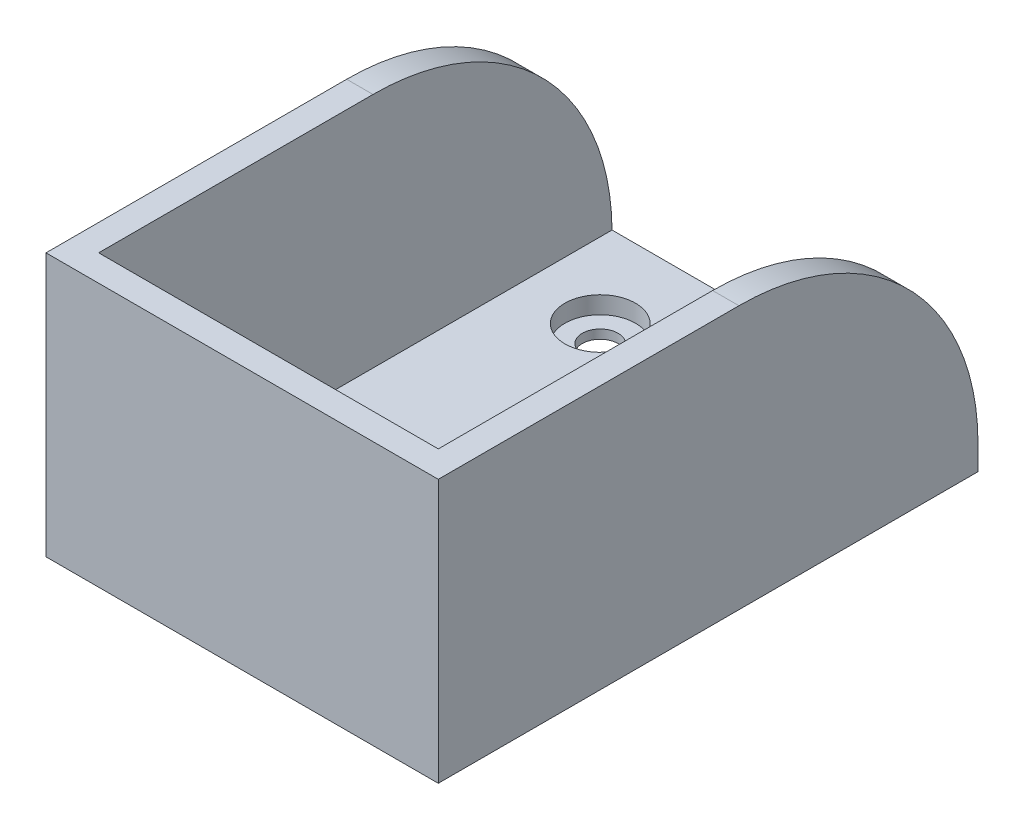
ISO-10303-21;
HEADER;
FILE_DESCRIPTION(('STEP AP214'),'2;1');
FILE_NAME('part.step','',(''),(''),'','','');
FILE_SCHEMA(('AUTOMOTIVE_DESIGN { 1 0 10303 214 1 1 1 1 }'));
ENDSEC;
DATA;
#1=APPLICATION_CONTEXT('core data for automotive mechanical design processes');
#2=APPLICATION_PROTOCOL_DEFINITION('international standard','automotive_design',2000,#1);
#3=PRODUCT_CONTEXT('',#1,'mechanical');
#4=PRODUCT('Part','Part','',(#3));
#5=PRODUCT_RELATED_PRODUCT_CATEGORY('part','',(#4));
#6=PRODUCT_DEFINITION_FORMATION('','',#4);
#7=PRODUCT_DEFINITION_CONTEXT('part definition',#1,'design');
#8=PRODUCT_DEFINITION('design','',#6,#7);
#9=PRODUCT_DEFINITION_SHAPE('','',#8);
#10=(LENGTH_UNIT() NAMED_UNIT(*) SI_UNIT(.MILLI.,.METRE.));
#11=(NAMED_UNIT(*) PLANE_ANGLE_UNIT() SI_UNIT($,.RADIAN.));
#12=(NAMED_UNIT(*) SI_UNIT($,.STERADIAN.) SOLID_ANGLE_UNIT());
#13=UNCERTAINTY_MEASURE_WITH_UNIT(LENGTH_MEASURE(1.E-05),#10,'distance_accuracy_value','');
#14=(GEOMETRIC_REPRESENTATION_CONTEXT(3) GLOBAL_UNCERTAINTY_ASSIGNED_CONTEXT((#13)) GLOBAL_UNIT_ASSIGNED_CONTEXT((#10,
#11,#12)) REPRESENTATION_CONTEXT('',''));
#15=CARTESIAN_POINT('',(0.,0.,0.));
#16=DIRECTION('',(0.,0.,1.));
#17=DIRECTION('',(1.,0.,0.));
#18=AXIS2_PLACEMENT_3D('',#15,#16,#17);
#19=CARTESIAN_POINT('',(-16.125,2.5,-23.125));
#20=DIRECTION('',(0.,0.,1.));
#21=DIRECTION('',(1.,0.,0.));
#22=AXIS2_PLACEMENT_3D('',#19,#20,#21);
#23=PLANE('',#22);
#24=DIRECTION('',(1.,0.,0.));
#25=VECTOR('',#24,1.);
#26=CARTESIAN_POINT('',(-16.125,2.3,-23.125));
#27=LINE('',#26,#25);
#28=CARTESIAN_POINT('',(-18.625,2.3,-23.125));
#29=VERTEX_POINT('',#28);
#30=CARTESIAN_POINT('',(18.625,2.3,-23.125));
#31=VERTEX_POINT('',#30);
#32=EDGE_CURVE('E274',#29,#31,#27,.T.);
#33=ORIENTED_EDGE('',*,*,#32,.T.);
#34=DIRECTION('',(0.,1.,0.));
#35=VECTOR('',#34,1.);
#36=CARTESIAN_POINT('',(18.625,0.,-23.125));
#37=LINE('',#36,#35);
#38=CARTESIAN_POINT('',(18.625,0.,-23.125));
#39=VERTEX_POINT('',#38);
#40=EDGE_CURVE('E167',#39,#31,#37,.T.);
#41=ORIENTED_EDGE('',*,*,#40,.F.);
#42=DIRECTION('',(-1.,0.,0.));
#43=VECTOR('',#42,1.);
#44=CARTESIAN_POINT('',(-16.125,0.,-23.125));
#45=LINE('',#44,#43);
#46=CARTESIAN_POINT('',(-18.625,0.,-23.125));
#47=VERTEX_POINT('',#46);
#48=EDGE_CURVE('E253',#39,#47,#45,.T.);
#49=ORIENTED_EDGE('',*,*,#48,.T.);
#50=DIRECTION('',(0.,1.,0.));
#51=VECTOR('',#50,1.);
#52=CARTESIAN_POINT('',(-18.625,0.,-23.125));
#53=LINE('',#52,#51);
#54=EDGE_CURVE('E117',#47,#29,#53,.T.);
#55=ORIENTED_EDGE('',*,*,#54,.T.);
#56=EDGE_LOOP('',(#33,#41,#49,#55));
#57=FACE_BOUND('',#56,.T.);
#58=ADVANCED_FACE('F39',(#57),#23,.F.);
#59=CARTESIAN_POINT('',(0.,2.5,0.));
#60=DIRECTION('',(0.,-1.,0.));
#61=DIRECTION('',(0.,0.,-1.));
#62=AXIS2_PLACEMENT_3D('',#59,#60,#61);
#63=PLANE('',#62);
#64=CARTESIAN_POINT('',(0.,2.5,9.125));
#65=DIRECTION('',(0.,1.,0.));
#66=DIRECTION('',(0.,0.,1.));
#67=AXIS2_PLACEMENT_3D('',#64,#65,#66);
#68=CIRCLE('',#67,3.125);
#69=CARTESIAN_POINT('',(0.,2.5,12.25));
#70=VERTEX_POINT('',#69);
#71=EDGE_CURVE('E179',#70,#70,#68,.T.);
#72=ORIENTED_EDGE('',*,*,#71,.F.);
#73=EDGE_LOOP('',(#72));
#74=FACE_BOUND('',#73,.T.);
#75=CARTESIAN_POINT('',(-8.99999999999999,2.5,-14.875));
#76=DIRECTION('',(0.,1.,0.));
#77=DIRECTION('',(0.,0.,1.));
#78=AXIS2_PLACEMENT_3D('',#75,#76,#77);
#79=CIRCLE('',#78,3.35);
#80=CARTESIAN_POINT('',(-8.99999999999999,2.5,-11.525));
#81=VERTEX_POINT('',#80);
#82=EDGE_CURVE('E189',#81,#81,#79,.T.);
#83=ORIENTED_EDGE('',*,*,#82,.F.);
#84=EDGE_LOOP('',(#83));
#85=FACE_BOUND('',#84,.T.);
#86=CARTESIAN_POINT('',(9.00000000000001,2.5,-14.875));
#87=DIRECTION('',(0.,1.,0.));
#88=DIRECTION('',(0.,0.,1.));
#89=AXIS2_PLACEMENT_3D('',#86,#87,#88);
#90=CIRCLE('',#89,3.35);
#91=CARTESIAN_POINT('',(9.00000000000001,2.5,-11.525));
#92=VERTEX_POINT('',#91);
#93=EDGE_CURVE('E205',#92,#92,#90,.T.);
#94=ORIENTED_EDGE('',*,*,#93,.F.);
#95=EDGE_LOOP('',(#94));
#96=FACE_BOUND('',#95,.T.);
#97=CARTESIAN_POINT('',(9.00000000000001,2.5,18.125));
#98=DIRECTION('',(0.,1.,0.));
#99=DIRECTION('',(0.,0.,1.));
#100=AXIS2_PLACEMENT_3D('',#97,#98,#99);
#101=CIRCLE('',#100,3.35);
#102=CARTESIAN_POINT('',(9.00000000000001,2.5,21.475));
#103=VERTEX_POINT('',#102);
#104=EDGE_CURVE('E221',#103,#103,#101,.T.);
#105=ORIENTED_EDGE('',*,*,#104,.F.);
#106=EDGE_LOOP('',(#105));
#107=FACE_BOUND('',#106,.T.);
#108=CARTESIAN_POINT('',(-8.99999999999999,2.5,18.125));
#109=DIRECTION('',(0.,1.,0.));
#110=DIRECTION('',(0.,0.,1.));
#111=AXIS2_PLACEMENT_3D('',#108,#109,#110);
#112=CIRCLE('',#111,3.35);
#113=CARTESIAN_POINT('',(-8.99999999999999,2.5,21.475));
#114=VERTEX_POINT('',#113);
#115=EDGE_CURVE('E237',#114,#114,#112,.T.);
#116=ORIENTED_EDGE('',*,*,#115,.F.);
#117=EDGE_LOOP('',(#116));
#118=FACE_BOUND('',#117,.T.);
#119=DIRECTION('',(0.,0.,-1.));
#120=VECTOR('',#119,1.);
#121=CARTESIAN_POINT('',(16.125,2.5,23.125));
#122=LINE('',#121,#120);
#123=CARTESIAN_POINT('',(16.125,2.5,25.625));
#124=VERTEX_POINT('',#123);
#125=CARTESIAN_POINT('',(16.125,2.5,-23.1241189256323));
#126=VERTEX_POINT('',#125);
#127=EDGE_CURVE('E254',#124,#126,#122,.T.);
#128=ORIENTED_EDGE('',*,*,#127,.T.);
#129=DIRECTION('',(1.,0.,0.));
#130=VECTOR('',#129,1.);
#131=CARTESIAN_POINT('',(16.125,2.5,-23.1241189256323));
#132=LINE('',#131,#130);
#133=CARTESIAN_POINT('',(-16.125,2.5,-23.1241189256323));
#134=VERTEX_POINT('',#133);
#135=EDGE_CURVE('E271',#126,#134,#132,.F.);
#136=ORIENTED_EDGE('',*,*,#135,.T.);
#137=DIRECTION('',(0.,0.,1.));
#138=VECTOR('',#137,1.);
#139=CARTESIAN_POINT('',(-16.125,2.5,23.125));
#140=LINE('',#139,#138);
#141=CARTESIAN_POINT('',(-16.125,2.5,25.625));
#142=VERTEX_POINT('',#141);
#143=EDGE_CURVE('E258',#134,#142,#140,.T.);
#144=ORIENTED_EDGE('',*,*,#143,.T.);
#145=DIRECTION('',(-1.,0.,0.));
#146=VECTOR('',#145,1.);
#147=CARTESIAN_POINT('',(16.125,2.5,25.625));
#148=LINE('',#147,#146);
#149=EDGE_CURVE('E152',#124,#142,#148,.T.);
#150=ORIENTED_EDGE('',*,*,#149,.F.);
#151=EDGE_LOOP('',(#128,#136,#144,#150));
#152=FACE_BOUND('',#151,.T.);
#153=ADVANCED_FACE('F295',(#74,#85,#96,#107,#118,#152),#63,.F.);
#154=CARTESIAN_POINT('',(0.,0.,0.));
#155=DIRECTION('',(0.,-1.,0.));
#156=DIRECTION('',(0.,0.,-1.));
#157=AXIS2_PLACEMENT_3D('',#154,#155,#156);
#158=PLANE('',#157);
#159=CARTESIAN_POINT('',(0.,0.,9.125));
#160=DIRECTION('',(0.,1.,0.));
#161=DIRECTION('',(0.,0.,1.));
#162=AXIS2_PLACEMENT_3D('',#159,#160,#161);
#163=CIRCLE('',#162,3.125);
#164=CARTESIAN_POINT('',(0.,0.,12.25));
#165=VERTEX_POINT('',#164);
#166=EDGE_CURVE('E185',#165,#165,#163,.T.);
#167=ORIENTED_EDGE('',*,*,#166,.T.);
#168=EDGE_LOOP('',(#167));
#169=FACE_BOUND('',#168,.T.);
#170=CARTESIAN_POINT('',(-8.99999999999999,0.,-14.875));
#171=DIRECTION('',(0.,1.,0.));
#172=DIRECTION('',(0.,0.,1.));
#173=AXIS2_PLACEMENT_3D('',#170,#171,#172);
#174=CIRCLE('',#173,1.7);
#175=CARTESIAN_POINT('',(-8.99999999999999,0.,-13.175));
#176=VERTEX_POINT('',#175);
#177=EDGE_CURVE('E201',#176,#176,#174,.T.);
#178=ORIENTED_EDGE('',*,*,#177,.T.);
#179=EDGE_LOOP('',(#178));
#180=FACE_BOUND('',#179,.T.);
#181=CARTESIAN_POINT('',(9.00000000000001,0.,-14.875));
#182=DIRECTION('',(0.,1.,0.));
#183=DIRECTION('',(0.,0.,1.));
#184=AXIS2_PLACEMENT_3D('',#181,#182,#183);
#185=CIRCLE('',#184,1.7);
#186=CARTESIAN_POINT('',(9.00000000000001,0.,-13.175));
#187=VERTEX_POINT('',#186);
#188=EDGE_CURVE('E217',#187,#187,#185,.T.);
#189=ORIENTED_EDGE('',*,*,#188,.T.);
#190=EDGE_LOOP('',(#189));
#191=FACE_BOUND('',#190,.T.);
#192=CARTESIAN_POINT('',(9.00000000000001,0.,18.125));
#193=DIRECTION('',(0.,1.,0.));
#194=DIRECTION('',(0.,0.,1.));
#195=AXIS2_PLACEMENT_3D('',#192,#193,#194);
#196=CIRCLE('',#195,1.7);
#197=CARTESIAN_POINT('',(9.00000000000001,0.,19.825));
#198=VERTEX_POINT('',#197);
#199=EDGE_CURVE('E233',#198,#198,#196,.T.);
#200=ORIENTED_EDGE('',*,*,#199,.T.);
#201=EDGE_LOOP('',(#200));
#202=FACE_BOUND('',#201,.T.);
#203=CARTESIAN_POINT('',(-8.99999999999999,0.,18.125));
#204=DIRECTION('',(0.,1.,0.));
#205=DIRECTION('',(0.,0.,1.));
#206=AXIS2_PLACEMENT_3D('',#203,#204,#205);
#207=CIRCLE('',#206,1.7);
#208=CARTESIAN_POINT('',(-8.99999999999999,0.,19.825));
#209=VERTEX_POINT('',#208);
#210=EDGE_CURVE('E249',#209,#209,#207,.T.);
#211=ORIENTED_EDGE('',*,*,#210,.T.);
#212=EDGE_LOOP('',(#211));
#213=FACE_BOUND('',#212,.T.);
#214=ORIENTED_EDGE('',*,*,#48,.F.);
#215=DIRECTION('',(0.,0.,-1.));
#216=VECTOR('',#215,1.);
#217=CARTESIAN_POINT('',(18.625,0.,23.125));
#218=LINE('',#217,#216);
#219=CARTESIAN_POINT('',(18.625,0.,28.125));
#220=VERTEX_POINT('',#219);
#221=EDGE_CURVE('E126',#220,#39,#218,.T.);
#222=ORIENTED_EDGE('',*,*,#221,.F.);
#223=DIRECTION('',(1.,0.,0.));
#224=VECTOR('',#223,1.);
#225=CARTESIAN_POINT('',(-18.625,0.,28.125));
#226=LINE('',#225,#224);
#227=CARTESIAN_POINT('',(-18.625,0.,28.125));
#228=VERTEX_POINT('',#227);
#229=EDGE_CURVE('E123',#228,#220,#226,.T.);
#230=ORIENTED_EDGE('',*,*,#229,.F.);
#231=DIRECTION('',(0.,0.,-1.));
#232=VECTOR('',#231,1.);
#233=CARTESIAN_POINT('',(-18.625,0.,23.125));
#234=LINE('',#233,#232);
#235=EDGE_CURVE('E111',#228,#47,#234,.T.);
#236=ORIENTED_EDGE('',*,*,#235,.T.);
#237=EDGE_LOOP('',(#214,#222,#230,#236));
#238=FACE_BOUND('',#237,.T.);
#239=ADVANCED_FACE('F124',(#169,#180,#191,#202,#213,#238),#158,.T.);
#240=CARTESIAN_POINT('',(-8.99999999999999,2.5,18.125));
#241=DIRECTION('',(0.,1.,0.));
#242=DIRECTION('',(0.,0.,1.));
#243=AXIS2_PLACEMENT_3D('',#240,#241,#242);
#244=CYLINDRICAL_SURFACE('',#243,1.7);
#245=ORIENTED_EDGE('',*,*,#210,.F.);
#246=EDGE_LOOP('',(#245));
#247=FACE_BOUND('',#246,.T.);
#248=CARTESIAN_POINT('',(-8.99999999999999,0.85,18.125));
#249=DIRECTION('',(0.,1.,0.));
#250=DIRECTION('',(0.,0.,1.));
#251=AXIS2_PLACEMENT_3D('',#248,#249,#250);
#252=CIRCLE('',#251,1.7);
#253=CARTESIAN_POINT('',(-8.99999999999999,0.85,19.825));
#254=VERTEX_POINT('',#253);
#255=EDGE_CURVE('E245',#254,#254,#252,.T.);
#256=ORIENTED_EDGE('',*,*,#255,.T.);
#257=EDGE_LOOP('',(#256));
#258=FACE_BOUND('',#257,.T.);
#259=ADVANCED_FACE('F312',(#247,#258),#244,.F.);
#260=CARTESIAN_POINT('',(-7.29999999999999,0.85,18.125));
#261=DIRECTION('',(0.,-1.,0.));
#262=DIRECTION('',(0.,0.,-1.));
#263=AXIS2_PLACEMENT_3D('',#260,#261,#262);
#264=PLANE('',#263);
#265=ORIENTED_EDGE('',*,*,#255,.F.);
#266=EDGE_LOOP('',(#265));
#267=FACE_BOUND('',#266,.T.);
#268=CARTESIAN_POINT('',(-8.99999999999999,0.85,18.125));
#269=DIRECTION('',(0.,1.,0.));
#270=DIRECTION('',(0.,0.,1.));
#271=AXIS2_PLACEMENT_3D('',#268,#269,#270);
#272=CIRCLE('',#271,3.35);
#273=CARTESIAN_POINT('',(-8.99999999999999,0.85,21.475));
#274=VERTEX_POINT('',#273);
#275=EDGE_CURVE('E241',#274,#274,#272,.T.);
#276=ORIENTED_EDGE('',*,*,#275,.T.);
#277=EDGE_LOOP('',(#276));
#278=FACE_BOUND('',#277,.T.);
#279=ADVANCED_FACE('F317',(#267,#278),#264,.F.);
#280=CARTESIAN_POINT('',(-8.99999999999999,2.5,18.125));
#281=DIRECTION('',(0.,1.,0.));
#282=DIRECTION('',(0.,0.,1.));
#283=AXIS2_PLACEMENT_3D('',#280,#281,#282);
#284=CYLINDRICAL_SURFACE('',#283,3.35);
#285=ORIENTED_EDGE('',*,*,#275,.F.);
#286=EDGE_LOOP('',(#285));
#287=FACE_BOUND('',#286,.T.);
#288=ORIENTED_EDGE('',*,*,#115,.T.);
#289=EDGE_LOOP('',(#288));
#290=FACE_BOUND('',#289,.T.);
#291=ADVANCED_FACE('F321',(#287,#290),#284,.F.);
#292=CARTESIAN_POINT('',(9.00000000000001,2.5,18.125));
#293=DIRECTION('',(0.,1.,0.));
#294=DIRECTION('',(0.,0.,1.));
#295=AXIS2_PLACEMENT_3D('',#292,#293,#294);
#296=CYLINDRICAL_SURFACE('',#295,1.7);
#297=ORIENTED_EDGE('',*,*,#199,.F.);
#298=EDGE_LOOP('',(#297));
#299=FACE_BOUND('',#298,.T.);
#300=CARTESIAN_POINT('',(9.00000000000001,0.85,18.125));
#301=DIRECTION('',(0.,1.,0.));
#302=DIRECTION('',(0.,0.,1.));
#303=AXIS2_PLACEMENT_3D('',#300,#301,#302);
#304=CIRCLE('',#303,1.7);
#305=CARTESIAN_POINT('',(9.00000000000001,0.85,19.825));
#306=VERTEX_POINT('',#305);
#307=EDGE_CURVE('E229',#306,#306,#304,.T.);
#308=ORIENTED_EDGE('',*,*,#307,.T.);
#309=EDGE_LOOP('',(#308));
#310=FACE_BOUND('',#309,.T.);
#311=ADVANCED_FACE('F325',(#299,#310),#296,.F.);
#312=CARTESIAN_POINT('',(10.7,0.85,18.125));
#313=DIRECTION('',(0.,-1.,0.));
#314=DIRECTION('',(0.,0.,-1.));
#315=AXIS2_PLACEMENT_3D('',#312,#313,#314);
#316=PLANE('',#315);
#317=ORIENTED_EDGE('',*,*,#307,.F.);
#318=EDGE_LOOP('',(#317));
#319=FACE_BOUND('',#318,.T.);
#320=CARTESIAN_POINT('',(9.00000000000001,0.85,18.125));
#321=DIRECTION('',(0.,1.,0.));
#322=DIRECTION('',(0.,0.,1.));
#323=AXIS2_PLACEMENT_3D('',#320,#321,#322);
#324=CIRCLE('',#323,3.35);
#325=CARTESIAN_POINT('',(9.00000000000001,0.85,21.475));
#326=VERTEX_POINT('',#325);
#327=EDGE_CURVE('E225',#326,#326,#324,.T.);
#328=ORIENTED_EDGE('',*,*,#327,.T.);
#329=EDGE_LOOP('',(#328));
#330=FACE_BOUND('',#329,.T.);
#331=ADVANCED_FACE('F329',(#319,#330),#316,.F.);
#332=CARTESIAN_POINT('',(9.00000000000001,2.5,18.125));
#333=DIRECTION('',(0.,1.,0.));
#334=DIRECTION('',(0.,0.,1.));
#335=AXIS2_PLACEMENT_3D('',#332,#333,#334);
#336=CYLINDRICAL_SURFACE('',#335,3.35);
#337=ORIENTED_EDGE('',*,*,#327,.F.);
#338=EDGE_LOOP('',(#337));
#339=FACE_BOUND('',#338,.T.);
#340=ORIENTED_EDGE('',*,*,#104,.T.);
#341=EDGE_LOOP('',(#340));
#342=FACE_BOUND('',#341,.T.);
#343=ADVANCED_FACE('F333',(#339,#342),#336,.F.);
#344=CARTESIAN_POINT('',(9.00000000000001,2.5,-14.875));
#345=DIRECTION('',(0.,1.,0.));
#346=DIRECTION('',(0.,0.,1.));
#347=AXIS2_PLACEMENT_3D('',#344,#345,#346);
#348=CYLINDRICAL_SURFACE('',#347,1.7);
#349=ORIENTED_EDGE('',*,*,#188,.F.);
#350=EDGE_LOOP('',(#349));
#351=FACE_BOUND('',#350,.T.);
#352=CARTESIAN_POINT('',(9.00000000000001,0.85,-14.875));
#353=DIRECTION('',(0.,1.,0.));
#354=DIRECTION('',(0.,0.,1.));
#355=AXIS2_PLACEMENT_3D('',#352,#353,#354);
#356=CIRCLE('',#355,1.7);
#357=CARTESIAN_POINT('',(9.00000000000001,0.85,-13.175));
#358=VERTEX_POINT('',#357);
#359=EDGE_CURVE('E213',#358,#358,#356,.T.);
#360=ORIENTED_EDGE('',*,*,#359,.T.);
#361=EDGE_LOOP('',(#360));
#362=FACE_BOUND('',#361,.T.);
#363=ADVANCED_FACE('F337',(#351,#362),#348,.F.);
#364=CARTESIAN_POINT('',(10.7,0.85,-14.875));
#365=DIRECTION('',(0.,-1.,0.));
#366=DIRECTION('',(0.,0.,-1.));
#367=AXIS2_PLACEMENT_3D('',#364,#365,#366);
#368=PLANE('',#367);
#369=ORIENTED_EDGE('',*,*,#359,.F.);
#370=EDGE_LOOP('',(#369));
#371=FACE_BOUND('',#370,.T.);
#372=CARTESIAN_POINT('',(9.00000000000001,0.85,-14.875));
#373=DIRECTION('',(0.,1.,0.));
#374=DIRECTION('',(0.,0.,1.));
#375=AXIS2_PLACEMENT_3D('',#372,#373,#374);
#376=CIRCLE('',#375,3.35);
#377=CARTESIAN_POINT('',(9.00000000000001,0.85,-11.525));
#378=VERTEX_POINT('',#377);
#379=EDGE_CURVE('E209',#378,#378,#376,.T.);
#380=ORIENTED_EDGE('',*,*,#379,.T.);
#381=EDGE_LOOP('',(#380));
#382=FACE_BOUND('',#381,.T.);
#383=ADVANCED_FACE('F341',(#371,#382),#368,.F.);
#384=CARTESIAN_POINT('',(9.00000000000001,2.5,-14.875));
#385=DIRECTION('',(0.,1.,0.));
#386=DIRECTION('',(0.,0.,1.));
#387=AXIS2_PLACEMENT_3D('',#384,#385,#386);
#388=CYLINDRICAL_SURFACE('',#387,3.35);
#389=ORIENTED_EDGE('',*,*,#379,.F.);
#390=EDGE_LOOP('',(#389));
#391=FACE_BOUND('',#390,.T.);
#392=ORIENTED_EDGE('',*,*,#93,.T.);
#393=EDGE_LOOP('',(#392));
#394=FACE_BOUND('',#393,.T.);
#395=ADVANCED_FACE('F345',(#391,#394),#388,.F.);
#396=CARTESIAN_POINT('',(-8.99999999999999,2.5,-14.875));
#397=DIRECTION('',(0.,1.,0.));
#398=DIRECTION('',(0.,0.,1.));
#399=AXIS2_PLACEMENT_3D('',#396,#397,#398);
#400=CYLINDRICAL_SURFACE('',#399,1.7);
#401=ORIENTED_EDGE('',*,*,#177,.F.);
#402=EDGE_LOOP('',(#401));
#403=FACE_BOUND('',#402,.T.);
#404=CARTESIAN_POINT('',(-8.99999999999999,0.85,-14.875));
#405=DIRECTION('',(0.,1.,0.));
#406=DIRECTION('',(0.,0.,1.));
#407=AXIS2_PLACEMENT_3D('',#404,#405,#406);
#408=CIRCLE('',#407,1.7);
#409=CARTESIAN_POINT('',(-8.99999999999999,0.85,-13.175));
#410=VERTEX_POINT('',#409);
#411=EDGE_CURVE('E197',#410,#410,#408,.T.);
#412=ORIENTED_EDGE('',*,*,#411,.T.);
#413=EDGE_LOOP('',(#412));
#414=FACE_BOUND('',#413,.T.);
#415=ADVANCED_FACE('F349',(#403,#414),#400,.F.);
#416=CARTESIAN_POINT('',(-7.29999999999999,0.85,-14.875));
#417=DIRECTION('',(0.,-1.,0.));
#418=DIRECTION('',(0.,0.,-1.));
#419=AXIS2_PLACEMENT_3D('',#416,#417,#418);
#420=PLANE('',#419);
#421=ORIENTED_EDGE('',*,*,#411,.F.);
#422=EDGE_LOOP('',(#421));
#423=FACE_BOUND('',#422,.T.);
#424=CARTESIAN_POINT('',(-8.99999999999999,0.85,-14.875));
#425=DIRECTION('',(0.,1.,0.));
#426=DIRECTION('',(0.,0.,1.));
#427=AXIS2_PLACEMENT_3D('',#424,#425,#426);
#428=CIRCLE('',#427,3.35);
#429=CARTESIAN_POINT('',(-8.99999999999999,0.85,-11.525));
#430=VERTEX_POINT('',#429);
#431=EDGE_CURVE('E193',#430,#430,#428,.T.);
#432=ORIENTED_EDGE('',*,*,#431,.T.);
#433=EDGE_LOOP('',(#432));
#434=FACE_BOUND('',#433,.T.);
#435=ADVANCED_FACE('F353',(#423,#434),#420,.F.);
#436=CARTESIAN_POINT('',(-8.99999999999999,2.5,-14.875));
#437=DIRECTION('',(0.,1.,0.));
#438=DIRECTION('',(0.,0.,1.));
#439=AXIS2_PLACEMENT_3D('',#436,#437,#438);
#440=CYLINDRICAL_SURFACE('',#439,3.35);
#441=ORIENTED_EDGE('',*,*,#431,.F.);
#442=EDGE_LOOP('',(#441));
#443=FACE_BOUND('',#442,.T.);
#444=ORIENTED_EDGE('',*,*,#82,.T.);
#445=EDGE_LOOP('',(#444));
#446=FACE_BOUND('',#445,.T.);
#447=ADVANCED_FACE('F357',(#443,#446),#440,.F.);
#448=CARTESIAN_POINT('',(0.,2.5,9.125));
#449=DIRECTION('',(0.,1.,0.));
#450=DIRECTION('',(0.,0.,1.));
#451=AXIS2_PLACEMENT_3D('',#448,#449,#450);
#452=CYLINDRICAL_SURFACE('',#451,3.125);
#453=ORIENTED_EDGE('',*,*,#166,.F.);
#454=EDGE_LOOP('',(#453));
#455=FACE_BOUND('',#454,.T.);
#456=ORIENTED_EDGE('',*,*,#71,.T.);
#457=EDGE_LOOP('',(#456));
#458=FACE_BOUND('',#457,.T.);
#459=ADVANCED_FACE('F361',(#455,#458),#452,.F.);
#460=CARTESIAN_POINT('',(-16.125,0.,0.));
#461=DIRECTION('',(1.,0.,0.));
#462=DIRECTION('',(0.,0.,-1.));
#463=AXIS2_PLACEMENT_3D('',#460,#461,#462);
#464=PLANE('',#463);
#465=ORIENTED_EDGE('',*,*,#143,.F.);
#466=CARTESIAN_POINT('',(-16.125,2.3,-0.424999999999998));
#467=DIRECTION('',(1.,0.,0.));
#468=DIRECTION('',(0.,0.,-1.));
#469=AXIS2_PLACEMENT_3D('',#466,#467,#468);
#470=CIRCLE('',#469,22.7);
#471=CARTESIAN_POINT('',(-16.125,25.,-0.425000000000002));
#472=VERTEX_POINT('',#471);
#473=EDGE_CURVE('E62',#134,#472,#470,.T.);
#474=ORIENTED_EDGE('',*,*,#473,.T.);
#475=DIRECTION('',(0.,0.,-1.));
#476=VECTOR('',#475,1.);
#477=CARTESIAN_POINT('',(-16.125,25.,23.125));
#478=LINE('',#477,#476);
#479=CARTESIAN_POINT('',(-16.125,25.,25.625));
#480=VERTEX_POINT('',#479);
#481=EDGE_CURVE('E120',#480,#472,#478,.T.);
#482=ORIENTED_EDGE('',*,*,#481,.F.);
#483=DIRECTION('',(0.,1.,0.));
#484=VECTOR('',#483,1.);
#485=CARTESIAN_POINT('',(-16.125,2.5,25.625));
#486=LINE('',#485,#484);
#487=EDGE_CURVE('E156',#142,#480,#486,.T.);
#488=ORIENTED_EDGE('',*,*,#487,.F.);
#489=EDGE_LOOP('',(#465,#474,#482,#488));
#490=FACE_BOUND('',#489,.T.);
#491=ADVANCED_FACE('F364',(#490),#464,.T.);
#492=CARTESIAN_POINT('',(-18.625,25.,23.125));
#493=DIRECTION('',(0.,-1.,0.));
#494=DIRECTION('',(0.,0.,-1.));
#495=AXIS2_PLACEMENT_3D('',#492,#493,#494);
#496=PLANE('',#495);
#497=ORIENTED_EDGE('',*,*,#481,.T.);
#498=DIRECTION('',(1.,0.,0.));
#499=VECTOR('',#498,1.);
#500=CARTESIAN_POINT('',(-18.625,25.,-0.425000000000002));
#501=LINE('',#500,#499);
#502=CARTESIAN_POINT('',(-18.625,25.,-0.425000000000002));
#503=VERTEX_POINT('',#502);
#504=EDGE_CURVE('E48',#472,#503,#501,.F.);
#505=ORIENTED_EDGE('',*,*,#504,.T.);
#506=DIRECTION('',(0.,0.,-1.));
#507=VECTOR('',#506,1.);
#508=CARTESIAN_POINT('',(-18.625,25.,23.125));
#509=LINE('',#508,#507);
#510=CARTESIAN_POINT('',(-18.625,25.,28.125));
#511=VERTEX_POINT('',#510);
#512=EDGE_CURVE('E176',#511,#503,#509,.T.);
#513=ORIENTED_EDGE('',*,*,#512,.F.);
#514=DIRECTION('',(-1.,0.,0.));
#515=VECTOR('',#514,1.);
#516=CARTESIAN_POINT('',(-18.625,25.,28.125));
#517=LINE('',#516,#515);
#518=CARTESIAN_POINT('',(18.625,25.,28.125));
#519=VERTEX_POINT('',#518);
#520=EDGE_CURVE('E136',#519,#511,#517,.T.);
#521=ORIENTED_EDGE('',*,*,#520,.F.);
#522=DIRECTION('',(0.,0.,-1.));
#523=VECTOR('',#522,1.);
#524=CARTESIAN_POINT('',(18.625,25.,23.125));
#525=LINE('',#524,#523);
#526=CARTESIAN_POINT('',(18.625,25.,-0.425000000000002));
#527=VERTEX_POINT('',#526);
#528=EDGE_CURVE('E163',#519,#527,#525,.T.);
#529=ORIENTED_EDGE('',*,*,#528,.T.);
#530=DIRECTION('',(-1.,0.,0.));
#531=VECTOR('',#530,1.);
#532=CARTESIAN_POINT('',(16.125,25.,-0.425000000000002));
#533=LINE('',#532,#531);
#534=CARTESIAN_POINT('',(16.125,25.,-0.425000000000002));
#535=VERTEX_POINT('',#534);
#536=EDGE_CURVE('E261',#527,#535,#533,.T.);
#537=ORIENTED_EDGE('',*,*,#536,.T.);
#538=DIRECTION('',(0.,0.,-1.));
#539=VECTOR('',#538,1.);
#540=CARTESIAN_POINT('',(16.125,25.,23.125));
#541=LINE('',#540,#539);
#542=CARTESIAN_POINT('',(16.125,25.,25.625));
#543=VERTEX_POINT('',#542);
#544=EDGE_CURVE('E160',#543,#535,#541,.T.);
#545=ORIENTED_EDGE('',*,*,#544,.F.);
#546=DIRECTION('',(-1.,0.,0.));
#547=VECTOR('',#546,1.);
#548=CARTESIAN_POINT('',(-18.625,25.,25.625));
#549=LINE('',#548,#547);
#550=EDGE_CURVE('E138',#543,#480,#549,.T.);
#551=ORIENTED_EDGE('',*,*,#550,.T.);
#552=EDGE_LOOP('',(#497,#505,#513,#521,#529,#537,#545,#551));
#553=FACE_BOUND('',#552,.T.);
#554=ADVANCED_FACE('F289',(#553),#496,.F.);
#555=CARTESIAN_POINT('',(-18.625,0.,0.));
#556=DIRECTION('',(1.,0.,0.));
#557=DIRECTION('',(0.,0.,-1.));
#558=AXIS2_PLACEMENT_3D('',#555,#556,#557);
#559=PLANE('',#558);
#560=ORIENTED_EDGE('',*,*,#512,.T.);
#561=CARTESIAN_POINT('',(-18.625,2.3,-0.424999999999998));
#562=DIRECTION('',(1.,0.,0.));
#563=DIRECTION('',(0.,0.,-1.));
#564=AXIS2_PLACEMENT_3D('',#561,#562,#563);
#565=CIRCLE('',#564,22.7);
#566=EDGE_CURVE('E11',#503,#29,#565,.F.);
#567=ORIENTED_EDGE('',*,*,#566,.T.);
#568=ORIENTED_EDGE('',*,*,#54,.F.);
#569=ORIENTED_EDGE('',*,*,#235,.F.);
#570=DIRECTION('',(0.,-1.,0.));
#571=VECTOR('',#570,1.);
#572=CARTESIAN_POINT('',(-18.625,25.,28.125));
#573=LINE('',#572,#571);
#574=EDGE_CURVE('E115',#511,#228,#573,.T.);
#575=ORIENTED_EDGE('',*,*,#574,.F.);
#576=EDGE_LOOP('',(#560,#567,#568,#569,#575));
#577=FACE_BOUND('',#576,.T.);
#578=ADVANCED_FACE('F113',(#577),#559,.F.);
#579=CARTESIAN_POINT('',(16.125,0.,0.));
#580=DIRECTION('',(-1.,0.,0.));
#581=DIRECTION('',(0.,0.,-1.));
#582=AXIS2_PLACEMENT_3D('',#579,#580,#581);
#583=PLANE('',#582);
#584=ORIENTED_EDGE('',*,*,#544,.T.);
#585=CARTESIAN_POINT('',(16.125,2.3,-0.424999999999998));
#586=DIRECTION('',(-1.,0.,0.));
#587=DIRECTION('',(0.,0.,1.));
#588=AXIS2_PLACEMENT_3D('',#585,#586,#587);
#589=CIRCLE('',#588,22.7);
#590=EDGE_CURVE('E267',#535,#126,#589,.T.);
#591=ORIENTED_EDGE('',*,*,#590,.T.);
#592=ORIENTED_EDGE('',*,*,#127,.F.);
#593=DIRECTION('',(0.,-1.,0.));
#594=VECTOR('',#593,1.);
#595=CARTESIAN_POINT('',(16.125,25.,25.625));
#596=LINE('',#595,#594);
#597=EDGE_CURVE('E147',#543,#124,#596,.T.);
#598=ORIENTED_EDGE('',*,*,#597,.F.);
#599=EDGE_LOOP('',(#584,#591,#592,#598));
#600=FACE_BOUND('',#599,.T.);
#601=ADVANCED_FACE('F291',(#600),#583,.T.);
#602=CARTESIAN_POINT('',(18.625,0.,0.));
#603=DIRECTION('',(-1.,0.,0.));
#604=DIRECTION('',(0.,0.,-1.));
#605=AXIS2_PLACEMENT_3D('',#602,#603,#604);
#606=PLANE('',#605);
#607=ORIENTED_EDGE('',*,*,#40,.T.);
#608=CARTESIAN_POINT('',(18.625,2.3,-0.424999999999998));
#609=DIRECTION('',(-1.,0.,0.));
#610=DIRECTION('',(0.,0.,1.));
#611=AXIS2_PLACEMENT_3D('',#608,#609,#610);
#612=CIRCLE('',#611,22.7);
#613=EDGE_CURVE('E277',#31,#527,#612,.F.);
#614=ORIENTED_EDGE('',*,*,#613,.T.);
#615=ORIENTED_EDGE('',*,*,#528,.F.);
#616=DIRECTION('',(0.,1.,0.));
#617=VECTOR('',#616,1.);
#618=CARTESIAN_POINT('',(18.625,25.,28.125));
#619=LINE('',#618,#617);
#620=EDGE_CURVE('E131',#220,#519,#619,.T.);
#621=ORIENTED_EDGE('',*,*,#620,.F.);
#622=ORIENTED_EDGE('',*,*,#221,.T.);
#623=EDGE_LOOP('',(#607,#614,#615,#621,#622));
#624=FACE_BOUND('',#623,.T.);
#625=ADVANCED_FACE('F284',(#624),#606,.F.);
#626=CARTESIAN_POINT('',(-16.125,2.3,-0.424999999999998));
#627=DIRECTION('',(1.,0.,0.));
#628=DIRECTION('',(0.,0.,-1.));
#629=AXIS2_PLACEMENT_3D('',#626,#627,#628);
#630=CYLINDRICAL_SURFACE('',#629,22.7);
#631=ORIENTED_EDGE('',*,*,#473,.F.);
#632=ORIENTED_EDGE('',*,*,#135,.F.);
#633=ORIENTED_EDGE('',*,*,#590,.F.);
#634=ORIENTED_EDGE('',*,*,#536,.F.);
#635=ORIENTED_EDGE('',*,*,#613,.F.);
#636=ORIENTED_EDGE('',*,*,#32,.F.);
#637=ORIENTED_EDGE('',*,*,#566,.F.);
#638=ORIENTED_EDGE('',*,*,#504,.F.);
#639=EDGE_LOOP('',(#631,#632,#633,#634,#635,#636,#637,#638));
#640=FACE_BOUND('',#639,.T.);
#641=ADVANCED_FACE('F41',(#640),#630,.T.);
#642=CARTESIAN_POINT('',(0.,0.,25.625));
#643=DIRECTION('',(0.,0.,1.));
#644=DIRECTION('',(1.,0.,0.));
#645=AXIS2_PLACEMENT_3D('',#642,#643,#644);
#646=PLANE('',#645);
#647=ORIENTED_EDGE('',*,*,#550,.F.);
#648=ORIENTED_EDGE('',*,*,#597,.T.);
#649=ORIENTED_EDGE('',*,*,#149,.T.);
#650=ORIENTED_EDGE('',*,*,#487,.T.);
#651=EDGE_LOOP('',(#647,#648,#649,#650));
#652=FACE_BOUND('',#651,.T.);
#653=ADVANCED_FACE('F299',(#652),#646,.F.);
#654=CARTESIAN_POINT('',(0.,0.,28.125));
#655=DIRECTION('',(0.,0.,1.));
#656=DIRECTION('',(1.,0.,0.));
#657=AXIS2_PLACEMENT_3D('',#654,#655,#656);
#658=PLANE('',#657);
#659=ORIENTED_EDGE('',*,*,#574,.T.);
#660=ORIENTED_EDGE('',*,*,#229,.T.);
#661=ORIENTED_EDGE('',*,*,#620,.T.);
#662=ORIENTED_EDGE('',*,*,#520,.T.);
#663=EDGE_LOOP('',(#659,#660,#661,#662));
#664=FACE_BOUND('',#663,.T.);
#665=ADVANCED_FACE('F134',(#664),#658,.T.);
#666=CLOSED_SHELL('',(#58,#153,#239,#259,#279,#291,#311,#331,#343,#363,#383,#395,#415,#435,#447,
#459,#491,#554,#578,#601,#625,#641,#653,#665));
#667=MANIFOLD_SOLID_BREP('B2',#666);
#668=ADVANCED_BREP_SHAPE_REPRESENTATION('',(#18,#667),#14);
#669=SHAPE_DEFINITION_REPRESENTATION(#9,#668);
ENDSEC;
END-ISO-10303-21;
